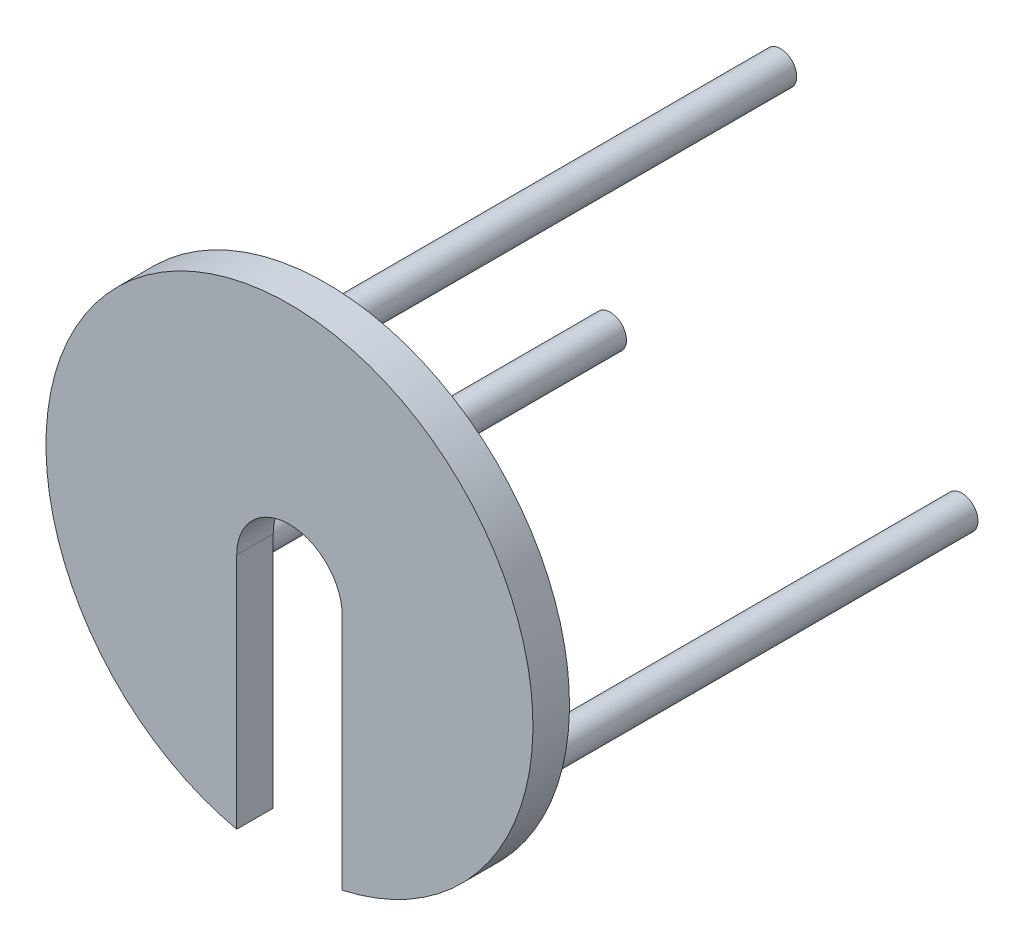
ISO-10303-21;
HEADER;
FILE_DESCRIPTION(('STEP AP214'),'2;1');
FILE_NAME('part.step','',(''),(''),'','','');
FILE_SCHEMA(('AUTOMOTIVE_DESIGN { 1 0 10303 214 1 1 1 1 }'));
ENDSEC;
DATA;
#1=APPLICATION_CONTEXT('core data for automotive mechanical design processes');
#2=APPLICATION_PROTOCOL_DEFINITION('international standard','automotive_design',2000,#1);
#3=PRODUCT_CONTEXT('',#1,'mechanical');
#4=PRODUCT('Part','Part','',(#3));
#5=PRODUCT_RELATED_PRODUCT_CATEGORY('part','',(#4));
#6=PRODUCT_DEFINITION_FORMATION('','',#4);
#7=PRODUCT_DEFINITION_CONTEXT('part definition',#1,'design');
#8=PRODUCT_DEFINITION('design','',#6,#7);
#9=PRODUCT_DEFINITION_SHAPE('','',#8);
#10=(LENGTH_UNIT() NAMED_UNIT(*) SI_UNIT(.MILLI.,.METRE.));
#11=(NAMED_UNIT(*) PLANE_ANGLE_UNIT() SI_UNIT($,.RADIAN.));
#12=(NAMED_UNIT(*) SI_UNIT($,.STERADIAN.) SOLID_ANGLE_UNIT());
#13=UNCERTAINTY_MEASURE_WITH_UNIT(LENGTH_MEASURE(1.E-05),#10,'distance_accuracy_value','');
#14=(GEOMETRIC_REPRESENTATION_CONTEXT(3) GLOBAL_UNCERTAINTY_ASSIGNED_CONTEXT((#13)) GLOBAL_UNIT_ASSIGNED_CONTEXT((#10,
#11,#12)) REPRESENTATION_CONTEXT('',''));
#15=CARTESIAN_POINT('',(0.,0.,0.));
#16=DIRECTION('',(0.,0.,1.));
#17=DIRECTION('',(1.,0.,0.));
#18=AXIS2_PLACEMENT_3D('',#15,#16,#17);
#19=CARTESIAN_POINT('',(0.,0.,-6.));
#20=DIRECTION('',(0.,0.,1.));
#21=DIRECTION('',(1.,0.,0.));
#22=AXIS2_PLACEMENT_3D('',#19,#20,#21);
#23=CYLINDRICAL_SURFACE('',#22,60.);
#24=DIRECTION('',(0.,0.,1.));
#25=VECTOR('',#24,1.);
#26=CARTESIAN_POINT('',(-13.,-58.5747385824299,-6.));
#27=LINE('',#26,#25);
#28=CARTESIAN_POINT('',(-13.,-58.5747385824299,3.));
#29=VERTEX_POINT('',#28);
#30=CARTESIAN_POINT('',(-13.,-58.5747385824299,-6.));
#31=VERTEX_POINT('',#30);
#32=EDGE_CURVE('E101',#29,#31,#27,.F.);
#33=ORIENTED_EDGE('',*,*,#32,.F.);
#34=CARTESIAN_POINT('',(0.,0.,3.));
#35=DIRECTION('',(0.,0.,1.));
#36=DIRECTION('',(1.,0.,0.));
#37=AXIS2_PLACEMENT_3D('',#34,#35,#36);
#38=CIRCLE('',#37,60.);
#39=CARTESIAN_POINT('',(13.,-58.5747385824299,3.));
#40=VERTEX_POINT('',#39);
#41=EDGE_CURVE('E95',#40,#29,#38,.T.);
#42=ORIENTED_EDGE('',*,*,#41,.F.);
#43=DIRECTION('',(0.,0.,1.));
#44=VECTOR('',#43,1.);
#45=CARTESIAN_POINT('',(13.,-58.5747385824299,-6.));
#46=LINE('',#45,#44);
#47=CARTESIAN_POINT('',(13.,-58.5747385824299,-6.));
#48=VERTEX_POINT('',#47);
#49=EDGE_CURVE('E147',#48,#40,#46,.T.);
#50=ORIENTED_EDGE('',*,*,#49,.F.);
#51=CARTESIAN_POINT('',(0.,0.,-6.));
#52=DIRECTION('',(0.,0.,1.));
#53=DIRECTION('',(1.,0.,0.));
#54=AXIS2_PLACEMENT_3D('',#51,#52,#53);
#55=CIRCLE('',#54,60.);
#56=EDGE_CURVE('E123',#48,#31,#55,.T.);
#57=ORIENTED_EDGE('',*,*,#56,.T.);
#58=EDGE_LOOP('',(#33,#42,#50,#57));
#59=FACE_BOUND('',#58,.T.);
#60=ADVANCED_FACE('F44',(#59),#23,.T.);
#61=CARTESIAN_POINT('',(0.,0.,-6.));
#62=DIRECTION('',(0.,0.,1.));
#63=DIRECTION('',(1.,0.,0.));
#64=AXIS2_PLACEMENT_3D('',#61,#62,#63);
#65=PLANE('',#64);
#66=CARTESIAN_POINT('',(44.6558185832552,-22.4912842376642,-6.00000000000001));
#67=DIRECTION('',(0.,0.,1.));
#68=DIRECTION('',(1.,0.,0.));
#69=AXIS2_PLACEMENT_3D('',#66,#67,#68);
#70=CIRCLE('',#69,4.);
#71=CARTESIAN_POINT('',(48.6558185832552,-22.4912842376642,-6.00000000000002));
#72=VERTEX_POINT('',#71);
#73=EDGE_CURVE('E135',#72,#72,#70,.F.);
#74=ORIENTED_EDGE('',*,*,#73,.F.);
#75=EDGE_LOOP('',(#74));
#76=FACE_BOUND('',#75,.T.);
#77=CARTESIAN_POINT('',(-41.9516890197429,-27.2039664091614,-6.00000000000001));
#78=DIRECTION('',(0.,0.,1.));
#79=DIRECTION('',(1.,0.,0.));
#80=AXIS2_PLACEMENT_3D('',#77,#78,#79);
#81=CIRCLE('',#80,4.);
#82=CARTESIAN_POINT('',(-37.9516890197429,-27.2039664091614,-6.00000000000002));
#83=VERTEX_POINT('',#82);
#84=EDGE_CURVE('E131',#83,#83,#81,.F.);
#85=ORIENTED_EDGE('',*,*,#84,.F.);
#86=EDGE_LOOP('',(#85));
#87=FACE_BOUND('',#86,.T.);
#88=CARTESIAN_POINT('',(0.,50.,-6.00000000000001));
#89=DIRECTION('',(0.,0.,1.));
#90=DIRECTION('',(1.,0.,0.));
#91=AXIS2_PLACEMENT_3D('',#88,#89,#90);
#92=CIRCLE('',#91,4.);
#93=CARTESIAN_POINT('',(4.,50.,-6.00000000000002));
#94=VERTEX_POINT('',#93);
#95=EDGE_CURVE('E127',#94,#94,#92,.F.);
#96=ORIENTED_EDGE('',*,*,#95,.F.);
#97=EDGE_LOOP('',(#96));
#98=FACE_BOUND('',#97,.T.);
#99=CARTESIAN_POINT('',(0.,0.,-6.));
#100=DIRECTION('',(0.,0.,1.));
#101=DIRECTION('',(1.,0.,0.));
#102=AXIS2_PLACEMENT_3D('',#99,#100,#101);
#103=CIRCLE('',#102,13.);
#104=CARTESIAN_POINT('',(13.,0.,-6.));
#105=VERTEX_POINT('',#104);
#106=CARTESIAN_POINT('',(-13.,0.,-6.));
#107=VERTEX_POINT('',#106);
#108=EDGE_CURVE('E100',#105,#107,#103,.T.);
#109=ORIENTED_EDGE('',*,*,#108,.T.);
#110=DIRECTION('',(0.,-1.,0.));
#111=VECTOR('',#110,1.);
#112=CARTESIAN_POINT('',(-13.,0.,-6.));
#113=LINE('',#112,#111);
#114=EDGE_CURVE('E59',#107,#31,#113,.T.);
#115=ORIENTED_EDGE('',*,*,#114,.T.);
#116=ORIENTED_EDGE('',*,*,#56,.F.);
#117=DIRECTION('',(0.,1.,0.));
#118=VECTOR('',#117,1.);
#119=CARTESIAN_POINT('',(13.,0.,-6.));
#120=LINE('',#119,#118);
#121=EDGE_CURVE('E141',#48,#105,#120,.T.);
#122=ORIENTED_EDGE('',*,*,#121,.T.);
#123=EDGE_LOOP('',(#109,#115,#116,#122));
#124=FACE_BOUND('',#123,.T.);
#125=ADVANCED_FACE('F145',(#76,#87,#98,#124),#65,.F.);
#126=CARTESIAN_POINT('',(0.,0.,3.));
#127=DIRECTION('',(0.,0.,1.));
#128=DIRECTION('',(1.,0.,0.));
#129=AXIS2_PLACEMENT_3D('',#126,#127,#128);
#130=PLANE('',#129);
#131=DIRECTION('',(0.,-1.,0.));
#132=VECTOR('',#131,1.);
#133=CARTESIAN_POINT('',(-13.,0.,3.));
#134=LINE('',#133,#132);
#135=CARTESIAN_POINT('',(-13.,0.,3.));
#136=VERTEX_POINT('',#135);
#137=EDGE_CURVE('E83',#136,#29,#134,.T.);
#138=ORIENTED_EDGE('',*,*,#137,.F.);
#139=CARTESIAN_POINT('',(0.,0.,3.));
#140=DIRECTION('',(0.,0.,1.));
#141=DIRECTION('',(1.,0.,0.));
#142=AXIS2_PLACEMENT_3D('',#139,#140,#141);
#143=CIRCLE('',#142,13.);
#144=CARTESIAN_POINT('',(13.,0.,3.));
#145=VERTEX_POINT('',#144);
#146=EDGE_CURVE('E93',#145,#136,#143,.T.);
#147=ORIENTED_EDGE('',*,*,#146,.F.);
#148=DIRECTION('',(0.,1.,0.));
#149=VECTOR('',#148,1.);
#150=CARTESIAN_POINT('',(13.,0.,3.));
#151=LINE('',#150,#149);
#152=EDGE_CURVE('E66',#40,#145,#151,.T.);
#153=ORIENTED_EDGE('',*,*,#152,.F.);
#154=ORIENTED_EDGE('',*,*,#41,.T.);
#155=EDGE_LOOP('',(#138,#147,#153,#154));
#156=FACE_BOUND('',#155,.T.);
#157=ADVANCED_FACE('F92',(#156),#130,.T.);
#158=CARTESIAN_POINT('',(0.,50.,-118.));
#159=DIRECTION('',(0.,0.,1.));
#160=DIRECTION('',(1.,0.,0.));
#161=AXIS2_PLACEMENT_3D('',#158,#159,#160);
#162=CYLINDRICAL_SURFACE('',#161,4.);
#163=CARTESIAN_POINT('',(0.,50.,-118.));
#164=DIRECTION('',(0.,0.,-1.));
#165=DIRECTION('',(-1.,0.,0.));
#166=AXIS2_PLACEMENT_3D('',#163,#164,#165);
#167=CIRCLE('',#166,4.);
#168=CARTESIAN_POINT('',(4.,50.,-118.));
#169=VERTEX_POINT('',#168);
#170=EDGE_CURVE('E114',#169,#169,#167,.T.);
#171=CARTESIAN_POINT('',(4.,50.,-118.));
#172=CARTESIAN_POINT('',(4.,50.,-116.833333333333));
#173=CARTESIAN_POINT('',(4.,50.,-115.666666666667));
#174=CARTESIAN_POINT('',(4.,50.,-113.333333333333));
#175=CARTESIAN_POINT('',(4.,50.,-112.166666666667));
#176=CARTESIAN_POINT('',(4.,50.,-109.833333333333));
#177=CARTESIAN_POINT('',(4.,50.,-108.666666666667));
#178=CARTESIAN_POINT('',(4.,50.,-106.333333333333));
#179=CARTESIAN_POINT('',(4.,50.,-105.166666666667));
#180=CARTESIAN_POINT('',(4.,50.,-102.833333333333));
#181=CARTESIAN_POINT('',(4.,50.,-101.666666666667));
#182=CARTESIAN_POINT('',(4.,50.,-99.3333333333333));
#183=CARTESIAN_POINT('',(4.,50.,-98.1666666666667));
#184=CARTESIAN_POINT('',(4.,50.,-95.8333333333333));
#185=CARTESIAN_POINT('',(4.,50.,-94.6666666666667));
#186=CARTESIAN_POINT('',(4.,50.,-92.3333333333333));
#187=CARTESIAN_POINT('',(4.,50.,-91.1666666666667));
#188=CARTESIAN_POINT('',(4.,50.,-88.8333333333333));
#189=CARTESIAN_POINT('',(4.,50.,-87.6666666666667));
#190=CARTESIAN_POINT('',(4.,50.,-85.3333333333333));
#191=CARTESIAN_POINT('',(4.,50.,-84.1666666666667));
#192=CARTESIAN_POINT('',(4.,50.,-81.8333333333333));
#193=CARTESIAN_POINT('',(4.,50.,-80.6666666666667));
#194=CARTESIAN_POINT('',(4.,50.,-78.3333333333333));
#195=CARTESIAN_POINT('',(4.,50.,-77.1666666666667));
#196=CARTESIAN_POINT('',(4.,50.,-74.8333333333333));
#197=CARTESIAN_POINT('',(4.,50.,-73.6666666666667));
#198=CARTESIAN_POINT('',(4.,50.,-71.3333333333333));
#199=CARTESIAN_POINT('',(4.,50.,-70.1666666666667));
#200=CARTESIAN_POINT('',(4.,50.,-67.8333333333333));
#201=CARTESIAN_POINT('',(4.,50.,-66.6666666666667));
#202=CARTESIAN_POINT('',(4.,50.,-64.3333333333333));
#203=CARTESIAN_POINT('',(4.,50.,-63.1666666666667));
#204=CARTESIAN_POINT('',(4.,50.,-60.8333333333333));
#205=CARTESIAN_POINT('',(4.,50.,-59.6666666666667));
#206=CARTESIAN_POINT('',(4.,50.,-57.3333333333333));
#207=CARTESIAN_POINT('',(4.,50.,-56.1666666666667));
#208=CARTESIAN_POINT('',(4.,50.,-53.8333333333333));
#209=CARTESIAN_POINT('',(4.,50.,-52.6666666666667));
#210=CARTESIAN_POINT('',(4.,50.,-50.3333333333333));
#211=CARTESIAN_POINT('',(4.,50.,-49.1666666666667));
#212=CARTESIAN_POINT('',(4.,50.,-46.8333333333333));
#213=CARTESIAN_POINT('',(4.,50.,-45.6666666666667));
#214=CARTESIAN_POINT('',(4.,50.,-43.3333333333333));
#215=CARTESIAN_POINT('',(4.,50.,-42.1666666666667));
#216=CARTESIAN_POINT('',(4.,50.,-39.8333333333333));
#217=CARTESIAN_POINT('',(4.,50.,-38.6666666666667));
#218=CARTESIAN_POINT('',(4.,50.,-36.3333333333333));
#219=CARTESIAN_POINT('',(4.,50.,-35.1666666666667));
#220=CARTESIAN_POINT('',(4.,50.,-32.8333333333333));
#221=CARTESIAN_POINT('',(4.,50.,-31.6666666666667));
#222=CARTESIAN_POINT('',(4.,50.,-29.3333333333333));
#223=CARTESIAN_POINT('',(4.,50.,-28.1666666666667));
#224=CARTESIAN_POINT('',(4.,50.,-25.8333333333333));
#225=CARTESIAN_POINT('',(4.,50.,-24.6666666666667));
#226=CARTESIAN_POINT('',(4.,50.,-22.3333333333334));
#227=CARTESIAN_POINT('',(4.,50.,-21.1666666666667));
#228=CARTESIAN_POINT('',(4.,50.,-18.8333333333333));
#229=CARTESIAN_POINT('',(4.,50.,-17.6666666666667));
#230=CARTESIAN_POINT('',(4.,50.,-15.3333333333333));
#231=CARTESIAN_POINT('',(4.,50.,-14.1666666666667));
#232=CARTESIAN_POINT('',(4.,50.,-11.8333333333333));
#233=CARTESIAN_POINT('',(4.,50.,-10.6666666666667));
#234=CARTESIAN_POINT('',(4.,50.,-8.33333333333335));
#235=CARTESIAN_POINT('',(4.,50.,-7.16666666666669));
#236=CARTESIAN_POINT('',(4.,50.,-6.00000000000002));
#237=B_SPLINE_CURVE_WITH_KNOTS('',3,(#171,#172,#173,#174,#175,#176,#177,#178,#179,#180,#181,
#182,#183,#184,#185,#186,#187,#188,#189,#190,#191,#192,#193,#194,#195,#196,#197,#198,#199,#200,
#201,#202,#203,#204,#205,#206,#207,#208,#209,#210,#211,#212,#213,#214,#215,#216,#217,#218,#219,
#220,#221,#222,#223,#224,#225,#226,#227,#228,#229,#230,#231,#232,#233,#234,#235,#236),
.UNSPECIFIED.,.F.,.F.,(4,2,2,2,2,2,2,2,2,2,2,2,2,2,2,2,2,2,2,2,2,2,2,2,2,2,2,2,2,2,2,2,4),(0.,
3.49999999999999,6.99999999999999,10.5,14.,17.5,21.,24.5,28.,31.5,35.,38.5,42.,45.5,49.,52.5,
56.,59.5,63.,66.5,70.,73.5,77.,80.5,84.,87.5,91.,94.5,98.,101.5,105.,108.5,112.),.UNSPECIFIED.);
#238=EDGE_CURVE('BSEAM164',#169,#94,#237,.T.);
#239=ORIENTED_EDGE('',*,*,#170,.F.);
#240=ORIENTED_EDGE('',*,*,#95,.T.);
#241=ORIENTED_EDGE('',*,*,#238,.T.);
#242=ORIENTED_EDGE('',*,*,#238,.F.);
#243=EDGE_LOOP('',(#239,#241,#240,#242));
#244=FACE_BOUND('',#243,.T.);
#245=ADVANCED_FACE('F164',(#244),#162,.T.);
#246=CARTESIAN_POINT('',(0.,50.,-118.));
#247=DIRECTION('',(0.,0.,-1.));
#248=DIRECTION('',(-1.,0.,0.));
#249=AXIS2_PLACEMENT_3D('',#246,#247,#248);
#250=PLANE('',#249);
#251=ORIENTED_EDGE('',*,*,#170,.T.);
#252=EDGE_LOOP('',(#251));
#253=FACE_BOUND('',#252,.T.);
#254=ADVANCED_FACE('F171',(#253),#250,.T.);
#255=CARTESIAN_POINT('',(-41.9516890197429,-27.2039664091614,-118.));
#256=DIRECTION('',(0.,0.,1.));
#257=DIRECTION('',(1.,0.,0.));
#258=AXIS2_PLACEMENT_3D('',#255,#256,#257);
#259=CYLINDRICAL_SURFACE('',#258,4.);
#260=CARTESIAN_POINT('',(-41.9516890197429,-27.2039664091614,-118.));
#261=DIRECTION('',(0.,0.,-1.));
#262=DIRECTION('',(-1.,0.,0.));
#263=AXIS2_PLACEMENT_3D('',#260,#261,#262);
#264=CIRCLE('',#263,4.);
#265=CARTESIAN_POINT('',(-37.9516890197429,-27.2039664091614,-118.));
#266=VERTEX_POINT('',#265);
#267=EDGE_CURVE('E105',#266,#266,#264,.T.);
#268=CARTESIAN_POINT('',(-37.9516890197429,-27.2039664091614,-118.));
#269=CARTESIAN_POINT('',(-37.9516890197429,-27.2039664091614,-116.833333333333));
#270=CARTESIAN_POINT('',(-37.9516890197429,-27.2039664091614,-115.666666666667));
#271=CARTESIAN_POINT('',(-37.9516890197429,-27.2039664091614,-113.333333333333));
#272=CARTESIAN_POINT('',(-37.9516890197429,-27.2039664091614,-112.166666666667));
#273=CARTESIAN_POINT('',(-37.9516890197429,-27.2039664091614,-109.833333333333));
#274=CARTESIAN_POINT('',(-37.9516890197429,-27.2039664091614,-108.666666666667));
#275=CARTESIAN_POINT('',(-37.9516890197429,-27.2039664091614,-106.333333333333));
#276=CARTESIAN_POINT('',(-37.9516890197429,-27.2039664091614,-105.166666666667));
#277=CARTESIAN_POINT('',(-37.9516890197429,-27.2039664091614,-102.833333333333));
#278=CARTESIAN_POINT('',(-37.9516890197429,-27.2039664091614,-101.666666666667));
#279=CARTESIAN_POINT('',(-37.9516890197429,-27.2039664091614,-99.3333333333333));
#280=CARTESIAN_POINT('',(-37.9516890197429,-27.2039664091614,-98.1666666666667));
#281=CARTESIAN_POINT('',(-37.9516890197429,-27.2039664091614,-95.8333333333333));
#282=CARTESIAN_POINT('',(-37.9516890197429,-27.2039664091614,-94.6666666666667));
#283=CARTESIAN_POINT('',(-37.9516890197429,-27.2039664091614,-92.3333333333333));
#284=CARTESIAN_POINT('',(-37.9516890197429,-27.2039664091614,-91.1666666666667));
#285=CARTESIAN_POINT('',(-37.9516890197429,-27.2039664091614,-88.8333333333333));
#286=CARTESIAN_POINT('',(-37.9516890197429,-27.2039664091614,-87.6666666666667));
#287=CARTESIAN_POINT('',(-37.9516890197429,-27.2039664091614,-85.3333333333333));
#288=CARTESIAN_POINT('',(-37.9516890197429,-27.2039664091614,-84.1666666666667));
#289=CARTESIAN_POINT('',(-37.9516890197429,-27.2039664091614,-81.8333333333333));
#290=CARTESIAN_POINT('',(-37.9516890197429,-27.2039664091614,-80.6666666666667));
#291=CARTESIAN_POINT('',(-37.9516890197429,-27.2039664091614,-78.3333333333333));
#292=CARTESIAN_POINT('',(-37.9516890197429,-27.2039664091614,-77.1666666666667));
#293=CARTESIAN_POINT('',(-37.9516890197429,-27.2039664091614,-74.8333333333333));
#294=CARTESIAN_POINT('',(-37.9516890197429,-27.2039664091614,-73.6666666666667));
#295=CARTESIAN_POINT('',(-37.9516890197429,-27.2039664091614,-71.3333333333333));
#296=CARTESIAN_POINT('',(-37.9516890197429,-27.2039664091614,-70.1666666666667));
#297=CARTESIAN_POINT('',(-37.9516890197429,-27.2039664091614,-67.8333333333333));
#298=CARTESIAN_POINT('',(-37.9516890197429,-27.2039664091614,-66.6666666666667));
#299=CARTESIAN_POINT('',(-37.9516890197429,-27.2039664091614,-64.3333333333333));
#300=CARTESIAN_POINT('',(-37.9516890197429,-27.2039664091614,-63.1666666666667));
#301=CARTESIAN_POINT('',(-37.9516890197429,-27.2039664091614,-60.8333333333333));
#302=CARTESIAN_POINT('',(-37.9516890197429,-27.2039664091614,-59.6666666666667));
#303=CARTESIAN_POINT('',(-37.9516890197429,-27.2039664091614,-57.3333333333333));
#304=CARTESIAN_POINT('',(-37.9516890197429,-27.2039664091614,-56.1666666666667));
#305=CARTESIAN_POINT('',(-37.9516890197429,-27.2039664091614,-53.8333333333333));
#306=CARTESIAN_POINT('',(-37.9516890197429,-27.2039664091614,-52.6666666666667));
#307=CARTESIAN_POINT('',(-37.9516890197429,-27.2039664091614,-50.3333333333333));
#308=CARTESIAN_POINT('',(-37.9516890197429,-27.2039664091614,-49.1666666666667));
#309=CARTESIAN_POINT('',(-37.9516890197429,-27.2039664091614,-46.8333333333333));
#310=CARTESIAN_POINT('',(-37.9516890197429,-27.2039664091614,-45.6666666666667));
#311=CARTESIAN_POINT('',(-37.9516890197429,-27.2039664091614,-43.3333333333333));
#312=CARTESIAN_POINT('',(-37.9516890197429,-27.2039664091614,-42.1666666666667));
#313=CARTESIAN_POINT('',(-37.9516890197429,-27.2039664091614,-39.8333333333333));
#314=CARTESIAN_POINT('',(-37.9516890197429,-27.2039664091614,-38.6666666666667));
#315=CARTESIAN_POINT('',(-37.9516890197429,-27.2039664091614,-36.3333333333333));
#316=CARTESIAN_POINT('',(-37.9516890197429,-27.2039664091614,-35.1666666666667));
#317=CARTESIAN_POINT('',(-37.9516890197429,-27.2039664091614,-32.8333333333333));
#318=CARTESIAN_POINT('',(-37.9516890197429,-27.2039664091614,-31.6666666666667));
#319=CARTESIAN_POINT('',(-37.9516890197429,-27.2039664091614,-29.3333333333333));
#320=CARTESIAN_POINT('',(-37.9516890197429,-27.2039664091614,-28.1666666666667));
#321=CARTESIAN_POINT('',(-37.9516890197429,-27.2039664091614,-25.8333333333333));
#322=CARTESIAN_POINT('',(-37.9516890197429,-27.2039664091614,-24.6666666666667));
#323=CARTESIAN_POINT('',(-37.9516890197429,-27.2039664091614,-22.3333333333334));
#324=CARTESIAN_POINT('',(-37.9516890197429,-27.2039664091614,-21.1666666666667));
#325=CARTESIAN_POINT('',(-37.9516890197429,-27.2039664091614,-18.8333333333333));
#326=CARTESIAN_POINT('',(-37.9516890197429,-27.2039664091614,-17.6666666666667));
#327=CARTESIAN_POINT('',(-37.9516890197429,-27.2039664091614,-15.3333333333333));
#328=CARTESIAN_POINT('',(-37.9516890197429,-27.2039664091614,-14.1666666666667));
#329=CARTESIAN_POINT('',(-37.9516890197429,-27.2039664091614,-11.8333333333333));
#330=CARTESIAN_POINT('',(-37.9516890197429,-27.2039664091614,-10.6666666666667));
#331=CARTESIAN_POINT('',(-37.9516890197429,-27.2039664091614,-8.33333333333335));
#332=CARTESIAN_POINT('',(-37.9516890197429,-27.2039664091614,-7.16666666666669));
#333=CARTESIAN_POINT('',(-37.9516890197429,-27.2039664091614,-6.00000000000002));
#334=B_SPLINE_CURVE_WITH_KNOTS('',3,(#268,#269,#270,#271,#272,#273,#274,#275,#276,#277,#278,
#279,#280,#281,#282,#283,#284,#285,#286,#287,#288,#289,#290,#291,#292,#293,#294,#295,#296,#297,
#298,#299,#300,#301,#302,#303,#304,#305,#306,#307,#308,#309,#310,#311,#312,#313,#314,#315,#316,
#317,#318,#319,#320,#321,#322,#323,#324,#325,#326,#327,#328,#329,#330,#331,#332,#333),
.UNSPECIFIED.,.F.,.F.,(4,2,2,2,2,2,2,2,2,2,2,2,2,2,2,2,2,2,2,2,2,2,2,2,2,2,2,2,2,2,2,2,4),(0.,
3.49999999999999,6.99999999999999,10.5,14.,17.5,21.,24.5,28.,31.5,35.,38.5,42.,45.5,49.,52.5,
56.,59.5,63.,66.5,70.,73.5,77.,80.5,84.,87.5,91.,94.5,98.,101.5,105.,108.5,112.),.UNSPECIFIED.);
#335=EDGE_CURVE('BSEAM175',#266,#83,#334,.T.);
#336=ORIENTED_EDGE('',*,*,#267,.F.);
#337=ORIENTED_EDGE('',*,*,#84,.T.);
#338=ORIENTED_EDGE('',*,*,#335,.T.);
#339=ORIENTED_EDGE('',*,*,#335,.F.);
#340=EDGE_LOOP('',(#336,#338,#337,#339));
#341=FACE_BOUND('',#340,.T.);
#342=ADVANCED_FACE('F175',(#341),#259,.T.);
#343=CARTESIAN_POINT('',(-41.9516890197429,-27.2039664091614,-118.));
#344=DIRECTION('',(0.,0.,-1.));
#345=DIRECTION('',(-1.,0.,0.));
#346=AXIS2_PLACEMENT_3D('',#343,#344,#345);
#347=PLANE('',#346);
#348=ORIENTED_EDGE('',*,*,#267,.T.);
#349=EDGE_LOOP('',(#348));
#350=FACE_BOUND('',#349,.T.);
#351=ADVANCED_FACE('F177',(#350),#347,.T.);
#352=CARTESIAN_POINT('',(44.6558185832552,-22.4912842376642,-118.));
#353=DIRECTION('',(0.,0.,1.));
#354=DIRECTION('',(1.,0.,0.));
#355=AXIS2_PLACEMENT_3D('',#352,#353,#354);
#356=CYLINDRICAL_SURFACE('',#355,4.);
#357=CARTESIAN_POINT('',(44.6558185832552,-22.4912842376642,-118.));
#358=DIRECTION('',(0.,0.,-1.));
#359=DIRECTION('',(-1.,0.,0.));
#360=AXIS2_PLACEMENT_3D('',#357,#358,#359);
#361=CIRCLE('',#360,4.);
#362=CARTESIAN_POINT('',(48.6558185832552,-22.4912842376642,-118.));
#363=VERTEX_POINT('',#362);
#364=EDGE_CURVE('E110',#363,#363,#361,.T.);
#365=CARTESIAN_POINT('',(48.6558185832552,-22.4912842376642,-118.));
#366=CARTESIAN_POINT('',(48.6558185832552,-22.4912842376642,-116.833333333333));
#367=CARTESIAN_POINT('',(48.6558185832552,-22.4912842376642,-115.666666666667));
#368=CARTESIAN_POINT('',(48.6558185832552,-22.4912842376642,-113.333333333333));
#369=CARTESIAN_POINT('',(48.6558185832552,-22.4912842376642,-112.166666666667));
#370=CARTESIAN_POINT('',(48.6558185832552,-22.4912842376642,-109.833333333333));
#371=CARTESIAN_POINT('',(48.6558185832552,-22.4912842376642,-108.666666666667));
#372=CARTESIAN_POINT('',(48.6558185832552,-22.4912842376642,-106.333333333333));
#373=CARTESIAN_POINT('',(48.6558185832552,-22.4912842376642,-105.166666666667));
#374=CARTESIAN_POINT('',(48.6558185832552,-22.4912842376642,-102.833333333333));
#375=CARTESIAN_POINT('',(48.6558185832552,-22.4912842376642,-101.666666666667));
#376=CARTESIAN_POINT('',(48.6558185832552,-22.4912842376642,-99.3333333333333));
#377=CARTESIAN_POINT('',(48.6558185832552,-22.4912842376642,-98.1666666666667));
#378=CARTESIAN_POINT('',(48.6558185832552,-22.4912842376642,-95.8333333333333));
#379=CARTESIAN_POINT('',(48.6558185832552,-22.4912842376642,-94.6666666666667));
#380=CARTESIAN_POINT('',(48.6558185832552,-22.4912842376642,-92.3333333333333));
#381=CARTESIAN_POINT('',(48.6558185832552,-22.4912842376642,-91.1666666666667));
#382=CARTESIAN_POINT('',(48.6558185832552,-22.4912842376642,-88.8333333333333));
#383=CARTESIAN_POINT('',(48.6558185832552,-22.4912842376642,-87.6666666666667));
#384=CARTESIAN_POINT('',(48.6558185832552,-22.4912842376642,-85.3333333333333));
#385=CARTESIAN_POINT('',(48.6558185832552,-22.4912842376642,-84.1666666666667));
#386=CARTESIAN_POINT('',(48.6558185832552,-22.4912842376642,-81.8333333333333));
#387=CARTESIAN_POINT('',(48.6558185832552,-22.4912842376642,-80.6666666666667));
#388=CARTESIAN_POINT('',(48.6558185832552,-22.4912842376642,-78.3333333333333));
#389=CARTESIAN_POINT('',(48.6558185832552,-22.4912842376642,-77.1666666666667));
#390=CARTESIAN_POINT('',(48.6558185832552,-22.4912842376642,-74.8333333333333));
#391=CARTESIAN_POINT('',(48.6558185832552,-22.4912842376642,-73.6666666666667));
#392=CARTESIAN_POINT('',(48.6558185832552,-22.4912842376642,-71.3333333333333));
#393=CARTESIAN_POINT('',(48.6558185832552,-22.4912842376642,-70.1666666666667));
#394=CARTESIAN_POINT('',(48.6558185832552,-22.4912842376642,-67.8333333333333));
#395=CARTESIAN_POINT('',(48.6558185832552,-22.4912842376642,-66.6666666666667));
#396=CARTESIAN_POINT('',(48.6558185832552,-22.4912842376642,-64.3333333333333));
#397=CARTESIAN_POINT('',(48.6558185832552,-22.4912842376642,-63.1666666666667));
#398=CARTESIAN_POINT('',(48.6558185832552,-22.4912842376642,-60.8333333333333));
#399=CARTESIAN_POINT('',(48.6558185832552,-22.4912842376642,-59.6666666666667));
#400=CARTESIAN_POINT('',(48.6558185832552,-22.4912842376642,-57.3333333333333));
#401=CARTESIAN_POINT('',(48.6558185832552,-22.4912842376642,-56.1666666666667));
#402=CARTESIAN_POINT('',(48.6558185832552,-22.4912842376642,-53.8333333333333));
#403=CARTESIAN_POINT('',(48.6558185832552,-22.4912842376642,-52.6666666666667));
#404=CARTESIAN_POINT('',(48.6558185832552,-22.4912842376642,-50.3333333333333));
#405=CARTESIAN_POINT('',(48.6558185832552,-22.4912842376642,-49.1666666666667));
#406=CARTESIAN_POINT('',(48.6558185832552,-22.4912842376642,-46.8333333333333));
#407=CARTESIAN_POINT('',(48.6558185832552,-22.4912842376642,-45.6666666666667));
#408=CARTESIAN_POINT('',(48.6558185832552,-22.4912842376642,-43.3333333333333));
#409=CARTESIAN_POINT('',(48.6558185832552,-22.4912842376642,-42.1666666666667));
#410=CARTESIAN_POINT('',(48.6558185832552,-22.4912842376642,-39.8333333333333));
#411=CARTESIAN_POINT('',(48.6558185832552,-22.4912842376642,-38.6666666666667));
#412=CARTESIAN_POINT('',(48.6558185832552,-22.4912842376642,-36.3333333333333));
#413=CARTESIAN_POINT('',(48.6558185832552,-22.4912842376642,-35.1666666666667));
#414=CARTESIAN_POINT('',(48.6558185832552,-22.4912842376642,-32.8333333333333));
#415=CARTESIAN_POINT('',(48.6558185832552,-22.4912842376642,-31.6666666666667));
#416=CARTESIAN_POINT('',(48.6558185832552,-22.4912842376642,-29.3333333333333));
#417=CARTESIAN_POINT('',(48.6558185832552,-22.4912842376642,-28.1666666666667));
#418=CARTESIAN_POINT('',(48.6558185832552,-22.4912842376642,-25.8333333333333));
#419=CARTESIAN_POINT('',(48.6558185832552,-22.4912842376642,-24.6666666666667));
#420=CARTESIAN_POINT('',(48.6558185832552,-22.4912842376642,-22.3333333333334));
#421=CARTESIAN_POINT('',(48.6558185832552,-22.4912842376642,-21.1666666666667));
#422=CARTESIAN_POINT('',(48.6558185832552,-22.4912842376642,-18.8333333333333));
#423=CARTESIAN_POINT('',(48.6558185832552,-22.4912842376642,-17.6666666666667));
#424=CARTESIAN_POINT('',(48.6558185832552,-22.4912842376642,-15.3333333333333));
#425=CARTESIAN_POINT('',(48.6558185832552,-22.4912842376642,-14.1666666666667));
#426=CARTESIAN_POINT('',(48.6558185832552,-22.4912842376642,-11.8333333333333));
#427=CARTESIAN_POINT('',(48.6558185832552,-22.4912842376642,-10.6666666666667));
#428=CARTESIAN_POINT('',(48.6558185832552,-22.4912842376642,-8.33333333333335));
#429=CARTESIAN_POINT('',(48.6558185832552,-22.4912842376642,-7.16666666666669));
#430=CARTESIAN_POINT('',(48.6558185832552,-22.4912842376642,-6.00000000000002));
#431=B_SPLINE_CURVE_WITH_KNOTS('',3,(#365,#366,#367,#368,#369,#370,#371,#372,#373,#374,#375,
#376,#377,#378,#379,#380,#381,#382,#383,#384,#385,#386,#387,#388,#389,#390,#391,#392,#393,#394,
#395,#396,#397,#398,#399,#400,#401,#402,#403,#404,#405,#406,#407,#408,#409,#410,#411,#412,#413,
#414,#415,#416,#417,#418,#419,#420,#421,#422,#423,#424,#425,#426,#427,#428,#429,#430),
.UNSPECIFIED.,.F.,.F.,(4,2,2,2,2,2,2,2,2,2,2,2,2,2,2,2,2,2,2,2,2,2,2,2,2,2,2,2,2,2,2,2,4),(0.,
3.49999999999999,6.99999999999999,10.5,14.,17.5,21.,24.5,28.,31.5,35.,38.5,42.,45.5,49.,52.5,
56.,59.5,63.,66.5,70.,73.5,77.,80.5,84.,87.5,91.,94.5,98.,101.5,105.,108.5,112.),.UNSPECIFIED.);
#432=EDGE_CURVE('BSEAM180',#363,#72,#431,.T.);
#433=ORIENTED_EDGE('',*,*,#364,.F.);
#434=ORIENTED_EDGE('',*,*,#73,.T.);
#435=ORIENTED_EDGE('',*,*,#432,.T.);
#436=ORIENTED_EDGE('',*,*,#432,.F.);
#437=EDGE_LOOP('',(#433,#435,#434,#436));
#438=FACE_BOUND('',#437,.T.);
#439=ADVANCED_FACE('F180',(#438),#356,.T.);
#440=CARTESIAN_POINT('',(44.6558185832552,-22.4912842376642,-118.));
#441=DIRECTION('',(0.,0.,-1.));
#442=DIRECTION('',(-1.,0.,0.));
#443=AXIS2_PLACEMENT_3D('',#440,#441,#442);
#444=PLANE('',#443);
#445=ORIENTED_EDGE('',*,*,#364,.T.);
#446=EDGE_LOOP('',(#445));
#447=FACE_BOUND('',#446,.T.);
#448=ADVANCED_FACE('F187',(#447),#444,.T.);
#449=CARTESIAN_POINT('',(0.,0.,-17.));
#450=DIRECTION('',(0.,0.,1.));
#451=DIRECTION('',(1.,0.,0.));
#452=AXIS2_PLACEMENT_3D('',#449,#450,#451);
#453=CYLINDRICAL_SURFACE('',#452,13.);
#454=ORIENTED_EDGE('',*,*,#146,.T.);
#455=DIRECTION('',(0.,0.,1.));
#456=VECTOR('',#455,1.);
#457=CARTESIAN_POINT('',(-13.,0.,-17.));
#458=LINE('',#457,#456);
#459=EDGE_CURVE('E11',#136,#107,#458,.F.);
#460=ORIENTED_EDGE('',*,*,#459,.T.);
#461=ORIENTED_EDGE('',*,*,#108,.F.);
#462=DIRECTION('',(0.,0.,1.));
#463=VECTOR('',#462,1.);
#464=CARTESIAN_POINT('',(13.,0.,-17.));
#465=LINE('',#464,#463);
#466=EDGE_CURVE('E52',#145,#105,#465,.F.);
#467=ORIENTED_EDGE('',*,*,#466,.F.);
#468=EDGE_LOOP('',(#454,#460,#461,#467));
#469=FACE_BOUND('',#468,.T.);
#470=ADVANCED_FACE('F98',(#469),#453,.F.);
#471=CARTESIAN_POINT('',(13.,0.,-7.));
#472=DIRECTION('',(1.,0.,0.));
#473=DIRECTION('',(0.,1.,0.));
#474=AXIS2_PLACEMENT_3D('',#471,#472,#473);
#475=PLANE('',#474);
#476=ORIENTED_EDGE('',*,*,#49,.T.);
#477=ORIENTED_EDGE('',*,*,#152,.T.);
#478=ORIENTED_EDGE('',*,*,#466,.T.);
#479=ORIENTED_EDGE('',*,*,#121,.F.);
#480=EDGE_LOOP('',(#476,#477,#478,#479));
#481=FACE_BOUND('',#480,.T.);
#482=ADVANCED_FACE('F140',(#481),#475,.F.);
#483=CARTESIAN_POINT('',(-13.,0.,-7.));
#484=DIRECTION('',(-1.,0.,0.));
#485=DIRECTION('',(0.,-1.,0.));
#486=AXIS2_PLACEMENT_3D('',#483,#484,#485);
#487=PLANE('',#486);
#488=ORIENTED_EDGE('',*,*,#32,.T.);
#489=ORIENTED_EDGE('',*,*,#114,.F.);
#490=ORIENTED_EDGE('',*,*,#459,.F.);
#491=ORIENTED_EDGE('',*,*,#137,.T.);
#492=EDGE_LOOP('',(#488,#489,#490,#491));
#493=FACE_BOUND('',#492,.T.);
#494=ADVANCED_FACE('F82',(#493),#487,.F.);
#495=CLOSED_SHELL('',(#60,#125,#157,#245,#254,#342,#351,#439,#448,#470,#482,#494));
#496=MANIFOLD_SOLID_BREP('B2',#495);
#497=ADVANCED_BREP_SHAPE_REPRESENTATION('',(#18,#496),#14);
#498=SHAPE_DEFINITION_REPRESENTATION(#9,#497);
ENDSEC;
END-ISO-10303-21;
